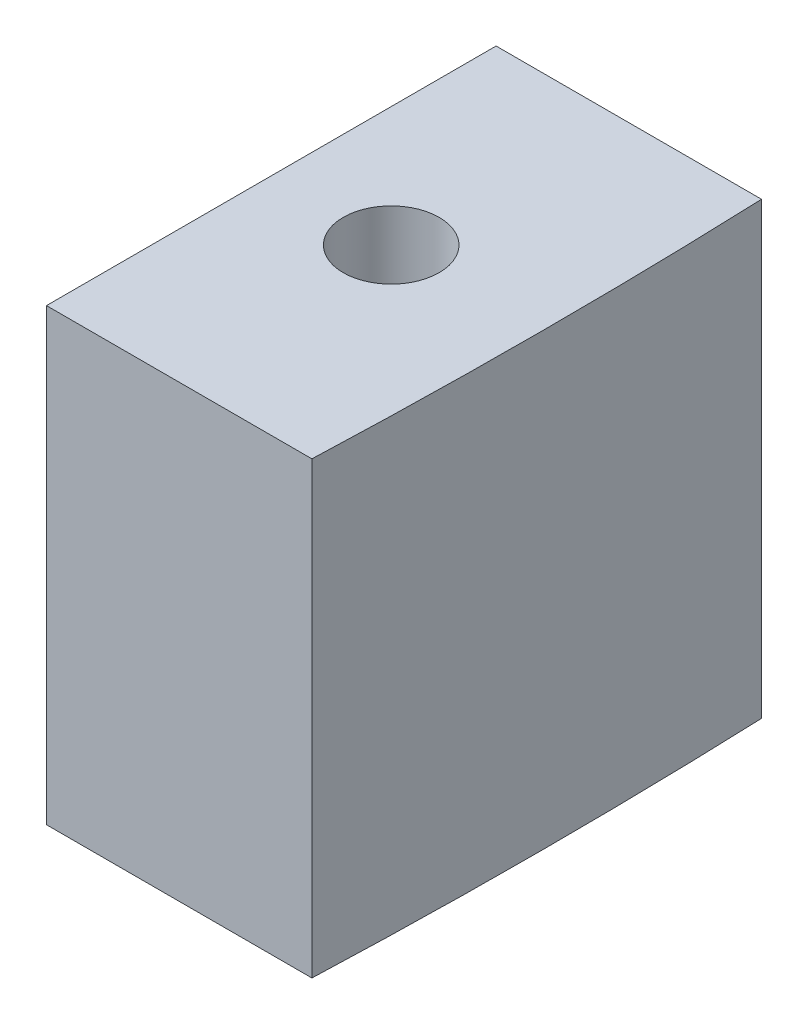
ISO-10303-21;
HEADER;
FILE_DESCRIPTION(('STEP AP214'),'2;1');
FILE_NAME('part.step','',(''),(''),'','','');
FILE_SCHEMA(('AUTOMOTIVE_DESIGN { 1 0 10303 214 1 1 1 1 }'));
ENDSEC;
DATA;
#1=APPLICATION_CONTEXT('core data for automotive mechanical design processes');
#2=APPLICATION_PROTOCOL_DEFINITION('international standard','automotive_design',2000,#1);
#3=PRODUCT_CONTEXT('',#1,'mechanical');
#4=PRODUCT('Part','Part','',(#3));
#5=PRODUCT_RELATED_PRODUCT_CATEGORY('part','',(#4));
#6=PRODUCT_DEFINITION_FORMATION('','',#4);
#7=PRODUCT_DEFINITION_CONTEXT('part definition',#1,'design');
#8=PRODUCT_DEFINITION('design','',#6,#7);
#9=PRODUCT_DEFINITION_SHAPE('','',#8);
#10=(LENGTH_UNIT() NAMED_UNIT(*) SI_UNIT(.MILLI.,.METRE.));
#11=(NAMED_UNIT(*) PLANE_ANGLE_UNIT() SI_UNIT($,.RADIAN.));
#12=(NAMED_UNIT(*) SI_UNIT($,.STERADIAN.) SOLID_ANGLE_UNIT());
#13=UNCERTAINTY_MEASURE_WITH_UNIT(LENGTH_MEASURE(1.E-05),#10,'distance_accuracy_value','');
#14=(GEOMETRIC_REPRESENTATION_CONTEXT(3) GLOBAL_UNCERTAINTY_ASSIGNED_CONTEXT((#13)) GLOBAL_UNIT_ASSIGNED_CONTEXT((#10,
#11,#12)) REPRESENTATION_CONTEXT('',''));
#15=CARTESIAN_POINT('',(0.,0.,0.));
#16=DIRECTION('',(0.,0.,1.));
#17=DIRECTION('',(1.,0.,0.));
#18=AXIS2_PLACEMENT_3D('',#15,#16,#17);
#19=CARTESIAN_POINT('',(-29.4485422847458,0.,0.));
#20=DIRECTION('',(0.,-1.,0.));
#21=DIRECTION('',(0.,0.,-1.));
#22=AXIS2_PLACEMENT_3D('',#19,#20,#21);
#23=CYLINDRICAL_SURFACE('',#22,1.59999999999999);
#24=CARTESIAN_POINT('',(-29.4485422847458,15.,0.));
#25=DIRECTION('',(0.,1.,0.));
#26=DIRECTION('',(0.,0.,1.));
#27=AXIS2_PLACEMENT_3D('',#24,#25,#26);
#28=CIRCLE('',#27,1.59999999999999);
#29=CARTESIAN_POINT('',(-29.4485422847458,15.,1.59999999999999));
#30=VERTEX_POINT('',#29);
#31=EDGE_CURVE('E167',#30,#30,#28,.T.);
#32=ORIENTED_EDGE('',*,*,#31,.T.);
#33=EDGE_LOOP('',(#32));
#34=FACE_BOUND('',#33,.T.);
#35=CARTESIAN_POINT('',(-29.4485422847458,4.,0.));
#36=DIRECTION('',(0.,-1.,0.));
#37=DIRECTION('',(0.,0.,-1.));
#38=AXIS2_PLACEMENT_3D('',#35,#36,#37);
#39=CIRCLE('',#38,1.59999999999999);
#40=CARTESIAN_POINT('',(-29.4485422847458,4.,-1.59999999999999));
#41=VERTEX_POINT('',#40);
#42=EDGE_CURVE('E38',#41,#41,#39,.F.);
#43=ORIENTED_EDGE('',*,*,#42,.F.);
#44=EDGE_LOOP('',(#43));
#45=FACE_BOUND('',#44,.T.);
#46=ADVANCED_FACE('F34',(#34,#45),#23,.F.);
#47=CARTESIAN_POINT('',(0.,0.,0.));
#48=DIRECTION('',(0.,1.,0.));
#49=DIRECTION('',(0.,0.,1.));
#50=AXIS2_PLACEMENT_3D('',#47,#48,#49);
#51=PLANE('',#50);
#52=DIRECTION('',(0.866025403784438,0.,0.5));
#53=VECTOR('',#52,1.);
#54=CARTESIAN_POINT('',(-29.4485422847458,0.,-3.34863156129983));
#55=LINE('',#54,#53);
#56=CARTESIAN_POINT('',(-29.4485422847458,0.,-3.34863156129983));
#57=VERTEX_POINT('',#56);
#58=CARTESIAN_POINT('',(-26.5485422847458,0.,-1.67431578064991));
#59=VERTEX_POINT('',#58);
#60=EDGE_CURVE('E148',#57,#59,#55,.T.);
#61=ORIENTED_EDGE('',*,*,#60,.F.);
#62=DIRECTION('',(0.866025403784439,0.,-0.5));
#63=VECTOR('',#62,1.);
#64=CARTESIAN_POINT('',(-32.3485422847457,0.,-1.67431578064992));
#65=LINE('',#64,#63);
#66=CARTESIAN_POINT('',(-32.3485422847457,0.,-1.67431578064992));
#67=VERTEX_POINT('',#66);
#68=EDGE_CURVE('E50',#67,#57,#65,.T.);
#69=ORIENTED_EDGE('',*,*,#68,.F.);
#70=DIRECTION('',(0.,0.,-1.));
#71=VECTOR('',#70,1.);
#72=CARTESIAN_POINT('',(-32.3485422847457,0.,1.67431578064991));
#73=LINE('',#72,#71);
#74=CARTESIAN_POINT('',(-32.3485422847457,0.,1.67431578064991));
#75=VERTEX_POINT('',#74);
#76=EDGE_CURVE('E134',#75,#67,#73,.T.);
#77=ORIENTED_EDGE('',*,*,#76,.F.);
#78=DIRECTION('',(-0.866025403784439,0.,-0.5));
#79=VECTOR('',#78,1.);
#80=CARTESIAN_POINT('',(-29.4485422847457,0.,3.34863156129982));
#81=LINE('',#80,#79);
#82=CARTESIAN_POINT('',(-29.4485422847457,0.,3.34863156129982));
#83=VERTEX_POINT('',#82);
#84=EDGE_CURVE('E137',#83,#75,#81,.T.);
#85=ORIENTED_EDGE('',*,*,#84,.F.);
#86=DIRECTION('',(-0.866025403784439,0.,0.5));
#87=VECTOR('',#86,1.);
#88=CARTESIAN_POINT('',(-26.5485422847458,0.,1.67431578064991));
#89=LINE('',#88,#87);
#90=CARTESIAN_POINT('',(-26.5485422847458,0.,1.67431578064991));
#91=VERTEX_POINT('',#90);
#92=EDGE_CURVE('E153',#91,#83,#89,.T.);
#93=ORIENTED_EDGE('',*,*,#92,.F.);
#94=DIRECTION('',(0.,0.,1.));
#95=VECTOR('',#94,1.);
#96=CARTESIAN_POINT('',(-26.5485422847458,0.,-1.67431578064991));
#97=LINE('',#96,#95);
#98=EDGE_CURVE('E150',#59,#91,#97,.T.);
#99=ORIENTED_EDGE('',*,*,#98,.F.);
#100=EDGE_LOOP('',(#61,#69,#77,#85,#93,#99));
#101=FACE_BOUND('',#100,.T.);
#102=DIRECTION('',(-1.,0.,0.));
#103=VECTOR('',#102,1.);
#104=CARTESIAN_POINT('',(-33.4485422847458,0.,-7.5));
#105=LINE('',#104,#103);
#106=CARTESIAN_POINT('',(-24.5935707209501,0.,-7.5));
#107=VERTEX_POINT('',#106);
#108=CARTESIAN_POINT('',(-33.4485422847458,0.,-7.5));
#109=VERTEX_POINT('',#108);
#110=EDGE_CURVE('E177',#107,#109,#105,.T.);
#111=ORIENTED_EDGE('',*,*,#110,.F.);
#112=CARTESIAN_POINT('',(-218.448542284746,0.,0.));
#113=DIRECTION('',(0.,1.,0.));
#114=DIRECTION('',(0.,0.,-1.));
#115=AXIS2_PLACEMENT_3D('',#112,#113,#114);
#116=CIRCLE('',#115,194.);
#117=CARTESIAN_POINT('',(-24.5935707209501,0.,7.5));
#118=VERTEX_POINT('',#117);
#119=EDGE_CURVE('E173',#118,#107,#116,.T.);
#120=ORIENTED_EDGE('',*,*,#119,.F.);
#121=DIRECTION('',(1.,0.,0.));
#122=VECTOR('',#121,1.);
#123=CARTESIAN_POINT('',(-33.4485422847458,0.,7.5));
#124=LINE('',#123,#122);
#125=CARTESIAN_POINT('',(-33.4485422847458,0.,7.5));
#126=VERTEX_POINT('',#125);
#127=EDGE_CURVE('E183',#126,#118,#124,.T.);
#128=ORIENTED_EDGE('',*,*,#127,.F.);
#129=DIRECTION('',(0.,0.,1.));
#130=VECTOR('',#129,1.);
#131=CARTESIAN_POINT('',(-33.4485422847458,0.,-7.5));
#132=LINE('',#131,#130);
#133=EDGE_CURVE('E189',#109,#126,#132,.T.);
#134=ORIENTED_EDGE('',*,*,#133,.F.);
#135=EDGE_LOOP('',(#111,#120,#128,#134));
#136=FACE_BOUND('',#135,.T.);
#137=ADVANCED_FACE('F204',(#101,#136),#51,.F.);
#138=CARTESIAN_POINT('',(-33.4485422847458,15.,-7.5));
#139=DIRECTION('',(0.,0.,1.));
#140=DIRECTION('',(1.,0.,0.));
#141=AXIS2_PLACEMENT_3D('',#138,#139,#140);
#142=PLANE('',#141);
#143=DIRECTION('',(-1.,0.,0.));
#144=VECTOR('',#143,1.);
#145=CARTESIAN_POINT('',(-33.4485422847458,15.,-7.5));
#146=LINE('',#145,#144);
#147=CARTESIAN_POINT('',(-24.5935707209501,15.,-7.5));
#148=VERTEX_POINT('',#147);
#149=CARTESIAN_POINT('',(-33.4485422847458,15.,-7.5));
#150=VERTEX_POINT('',#149);
#151=EDGE_CURVE('E180',#148,#150,#146,.T.);
#152=ORIENTED_EDGE('',*,*,#151,.F.);
#153=DIRECTION('',(0.,-1.,0.));
#154=VECTOR('',#153,1.);
#155=CARTESIAN_POINT('',(-24.5935707209501,15.001,-7.5));
#156=LINE('',#155,#154);
#157=EDGE_CURVE('E175',#148,#107,#156,.T.);
#158=ORIENTED_EDGE('',*,*,#157,.T.);
#159=ORIENTED_EDGE('',*,*,#110,.T.);
#160=DIRECTION('',(0.,-1.,0.));
#161=VECTOR('',#160,1.);
#162=CARTESIAN_POINT('',(-33.4485422847458,15.,-7.5));
#163=LINE('',#162,#161);
#164=EDGE_CURVE('E11',#150,#109,#163,.T.);
#165=ORIENTED_EDGE('',*,*,#164,.F.);
#166=EDGE_LOOP('',(#152,#158,#159,#165));
#167=FACE_BOUND('',#166,.T.);
#168=ADVANCED_FACE('F36',(#167),#142,.F.);
#169=CARTESIAN_POINT('',(-33.4485422847458,15.,-7.5));
#170=DIRECTION('',(1.,0.,0.));
#171=DIRECTION('',(0.,0.,-1.));
#172=AXIS2_PLACEMENT_3D('',#169,#170,#171);
#173=PLANE('',#172);
#174=ORIENTED_EDGE('',*,*,#133,.T.);
#175=DIRECTION('',(0.,-1.,0.));
#176=VECTOR('',#175,1.);
#177=CARTESIAN_POINT('',(-33.4485422847458,15.,7.5));
#178=LINE('',#177,#176);
#179=CARTESIAN_POINT('',(-33.4485422847458,15.,7.5));
#180=VERTEX_POINT('',#179);
#181=EDGE_CURVE('E43',#180,#126,#178,.T.);
#182=ORIENTED_EDGE('',*,*,#181,.F.);
#183=DIRECTION('',(0.,0.,1.));
#184=VECTOR('',#183,1.);
#185=CARTESIAN_POINT('',(-33.4485422847458,15.,-7.5));
#186=LINE('',#185,#184);
#187=EDGE_CURVE('E182',#150,#180,#186,.T.);
#188=ORIENTED_EDGE('',*,*,#187,.F.);
#189=ORIENTED_EDGE('',*,*,#164,.T.);
#190=EDGE_LOOP('',(#174,#182,#188,#189));
#191=FACE_BOUND('',#190,.T.);
#192=ADVANCED_FACE('F211',(#191),#173,.F.);
#193=CARTESIAN_POINT('',(-33.4485422847458,15.,7.5));
#194=DIRECTION('',(0.,0.,-1.));
#195=DIRECTION('',(-1.,0.,0.));
#196=AXIS2_PLACEMENT_3D('',#193,#194,#195);
#197=PLANE('',#196);
#198=ORIENTED_EDGE('',*,*,#127,.T.);
#199=DIRECTION('',(0.,-1.,0.));
#200=VECTOR('',#199,1.);
#201=CARTESIAN_POINT('',(-24.5935707209501,15.001,7.5));
#202=LINE('',#201,#200);
#203=CARTESIAN_POINT('',(-24.5935707209501,15.,7.5));
#204=VERTEX_POINT('',#203);
#205=EDGE_CURVE('E58',#204,#118,#202,.T.);
#206=ORIENTED_EDGE('',*,*,#205,.F.);
#207=DIRECTION('',(1.,0.,0.));
#208=VECTOR('',#207,1.);
#209=CARTESIAN_POINT('',(-33.4485422847458,15.,7.5));
#210=LINE('',#209,#208);
#211=EDGE_CURVE('E185',#180,#204,#210,.T.);
#212=ORIENTED_EDGE('',*,*,#211,.F.);
#213=ORIENTED_EDGE('',*,*,#181,.T.);
#214=EDGE_LOOP('',(#198,#206,#212,#213));
#215=FACE_BOUND('',#214,.T.);
#216=ADVANCED_FACE('F198',(#215),#197,.F.);
#217=CARTESIAN_POINT('',(0.,15.,0.));
#218=DIRECTION('',(0.,1.,0.));
#219=DIRECTION('',(0.,0.,1.));
#220=AXIS2_PLACEMENT_3D('',#217,#218,#219);
#221=PLANE('',#220);
#222=ORIENTED_EDGE('',*,*,#31,.F.);
#223=EDGE_LOOP('',(#222));
#224=FACE_BOUND('',#223,.T.);
#225=CARTESIAN_POINT('',(-218.448542284746,15.,0.));
#226=DIRECTION('',(0.,1.,0.));
#227=DIRECTION('',(0.,0.,1.));
#228=AXIS2_PLACEMENT_3D('',#225,#226,#227);
#229=CIRCLE('',#228,194.);
#230=EDGE_CURVE('E170',#204,#148,#229,.T.);
#231=ORIENTED_EDGE('',*,*,#230,.T.);
#232=ORIENTED_EDGE('',*,*,#151,.T.);
#233=ORIENTED_EDGE('',*,*,#187,.T.);
#234=ORIENTED_EDGE('',*,*,#211,.T.);
#235=EDGE_LOOP('',(#231,#232,#233,#234));
#236=FACE_BOUND('',#235,.T.);
#237=ADVANCED_FACE('F210',(#224,#236),#221,.T.);
#238=CARTESIAN_POINT('',(-218.448542284746,15.001,0.));
#239=DIRECTION('',(0.,-1.,0.));
#240=DIRECTION('',(0.,0.,-1.));
#241=AXIS2_PLACEMENT_3D('',#238,#239,#240);
#242=CYLINDRICAL_SURFACE('',#241,194.);
#243=ORIENTED_EDGE('',*,*,#205,.T.);
#244=ORIENTED_EDGE('',*,*,#119,.T.);
#245=ORIENTED_EDGE('',*,*,#157,.F.);
#246=ORIENTED_EDGE('',*,*,#230,.F.);
#247=EDGE_LOOP('',(#243,#244,#245,#246));
#248=FACE_BOUND('',#247,.T.);
#249=ADVANCED_FACE('F205',(#248),#242,.T.);
#250=CARTESIAN_POINT('',(0.,4.,0.));
#251=DIRECTION('',(0.,-1.,0.));
#252=DIRECTION('',(0.,0.,-1.));
#253=AXIS2_PLACEMENT_3D('',#250,#251,#252);
#254=PLANE('',#253);
#255=DIRECTION('',(0.866025403784439,0.,-0.5));
#256=VECTOR('',#255,1.);
#257=CARTESIAN_POINT('',(-32.3485422847457,4.,-1.67431578064992));
#258=LINE('',#257,#256);
#259=CARTESIAN_POINT('',(-32.3485422847457,4.,-1.67431578064992));
#260=VERTEX_POINT('',#259);
#261=CARTESIAN_POINT('',(-29.4485422847458,4.,-3.34863156129983));
#262=VERTEX_POINT('',#261);
#263=EDGE_CURVE('E114',#260,#262,#258,.T.);
#264=ORIENTED_EDGE('',*,*,#263,.T.);
#265=DIRECTION('',(0.866025403784438,0.,0.5));
#266=VECTOR('',#265,1.);
#267=CARTESIAN_POINT('',(-29.4485422847458,4.,-3.34863156129983));
#268=LINE('',#267,#266);
#269=CARTESIAN_POINT('',(-26.5485422847458,4.,-1.67431578064991));
#270=VERTEX_POINT('',#269);
#271=EDGE_CURVE('E123',#262,#270,#268,.T.);
#272=ORIENTED_EDGE('',*,*,#271,.T.);
#273=DIRECTION('',(0.,0.,1.));
#274=VECTOR('',#273,1.);
#275=CARTESIAN_POINT('',(-26.5485422847458,4.,-1.67431578064991));
#276=LINE('',#275,#274);
#277=CARTESIAN_POINT('',(-26.5485422847458,4.,1.67431578064991));
#278=VERTEX_POINT('',#277);
#279=EDGE_CURVE('E128',#270,#278,#276,.T.);
#280=ORIENTED_EDGE('',*,*,#279,.T.);
#281=DIRECTION('',(-0.866025403784439,0.,0.5));
#282=VECTOR('',#281,1.);
#283=CARTESIAN_POINT('',(-26.5485422847458,4.,1.67431578064991));
#284=LINE('',#283,#282);
#285=CARTESIAN_POINT('',(-29.4485422847457,4.,3.34863156129982));
#286=VERTEX_POINT('',#285);
#287=EDGE_CURVE('E141',#278,#286,#284,.T.);
#288=ORIENTED_EDGE('',*,*,#287,.T.);
#289=DIRECTION('',(-0.866025403784439,0.,-0.5));
#290=VECTOR('',#289,1.);
#291=CARTESIAN_POINT('',(-29.4485422847457,4.,3.34863156129982));
#292=LINE('',#291,#290);
#293=CARTESIAN_POINT('',(-32.3485422847457,4.,1.67431578064991));
#294=VERTEX_POINT('',#293);
#295=EDGE_CURVE('E144',#286,#294,#292,.T.);
#296=ORIENTED_EDGE('',*,*,#295,.T.);
#297=DIRECTION('',(0.,0.,-1.));
#298=VECTOR('',#297,1.);
#299=CARTESIAN_POINT('',(-32.3485422847457,4.,1.67431578064991));
#300=LINE('',#299,#298);
#301=EDGE_CURVE('E120',#294,#260,#300,.T.);
#302=ORIENTED_EDGE('',*,*,#301,.T.);
#303=EDGE_LOOP('',(#264,#272,#280,#288,#296,#302));
#304=FACE_BOUND('',#303,.T.);
#305=ORIENTED_EDGE('',*,*,#42,.T.);
#306=EDGE_LOOP('',(#305));
#307=FACE_BOUND('',#306,.T.);
#308=ADVANCED_FACE('F130',(#304,#307),#254,.T.);
#309=CARTESIAN_POINT('',(-32.3485422847457,4.,-1.67431578064992));
#310=DIRECTION('',(-0.5,0.,-0.866025403784439));
#311=DIRECTION('',(-0.866025403784439,0.,0.5));
#312=AXIS2_PLACEMENT_3D('',#309,#310,#311);
#313=PLANE('',#312);
#314=ORIENTED_EDGE('',*,*,#68,.T.);
#315=DIRECTION('',(0.,-1.,0.));
#316=VECTOR('',#315,1.);
#317=CARTESIAN_POINT('',(-29.4485422847458,4.,-3.34863156129983));
#318=LINE('',#317,#316);
#319=EDGE_CURVE('E110',#262,#57,#318,.T.);
#320=ORIENTED_EDGE('',*,*,#319,.F.);
#321=ORIENTED_EDGE('',*,*,#263,.F.);
#322=DIRECTION('',(0.,-1.,0.));
#323=VECTOR('',#322,1.);
#324=CARTESIAN_POINT('',(-32.3485422847457,4.,-1.67431578064992));
#325=LINE('',#324,#323);
#326=EDGE_CURVE('E158',#260,#67,#325,.T.);
#327=ORIENTED_EDGE('',*,*,#326,.T.);
#328=EDGE_LOOP('',(#314,#320,#321,#327));
#329=FACE_BOUND('',#328,.T.);
#330=ADVANCED_FACE('F112',(#329),#313,.F.);
#331=CARTESIAN_POINT('',(-32.3485422847457,4.,1.67431578064991));
#332=DIRECTION('',(-1.,0.,0.));
#333=DIRECTION('',(0.,0.,1.));
#334=AXIS2_PLACEMENT_3D('',#331,#332,#333);
#335=PLANE('',#334);
#336=ORIENTED_EDGE('',*,*,#76,.T.);
#337=ORIENTED_EDGE('',*,*,#326,.F.);
#338=ORIENTED_EDGE('',*,*,#301,.F.);
#339=DIRECTION('',(0.,-1.,0.));
#340=VECTOR('',#339,1.);
#341=CARTESIAN_POINT('',(-32.3485422847457,4.,1.67431578064991));
#342=LINE('',#341,#340);
#343=EDGE_CURVE('E160',#294,#75,#342,.T.);
#344=ORIENTED_EDGE('',*,*,#343,.T.);
#345=EDGE_LOOP('',(#336,#337,#338,#344));
#346=FACE_BOUND('',#345,.T.);
#347=ADVANCED_FACE('F266',(#346),#335,.F.);
#348=CARTESIAN_POINT('',(-29.4485422847457,4.,3.34863156129982));
#349=DIRECTION('',(-0.5,0.,0.866025403784439));
#350=DIRECTION('',(0.866025403784439,0.,0.5));
#351=AXIS2_PLACEMENT_3D('',#348,#349,#350);
#352=PLANE('',#351);
#353=ORIENTED_EDGE('',*,*,#84,.T.);
#354=ORIENTED_EDGE('',*,*,#343,.F.);
#355=ORIENTED_EDGE('',*,*,#295,.F.);
#356=DIRECTION('',(0.,-1.,0.));
#357=VECTOR('',#356,1.);
#358=CARTESIAN_POINT('',(-29.4485422847457,4.,3.34863156129982));
#359=LINE('',#358,#357);
#360=EDGE_CURVE('E162',#286,#83,#359,.T.);
#361=ORIENTED_EDGE('',*,*,#360,.T.);
#362=EDGE_LOOP('',(#353,#354,#355,#361));
#363=FACE_BOUND('',#362,.T.);
#364=ADVANCED_FACE('F274',(#363),#352,.F.);
#365=CARTESIAN_POINT('',(-26.5485422847458,4.,1.67431578064991));
#366=DIRECTION('',(0.5,0.,0.866025403784439));
#367=DIRECTION('',(0.866025403784439,0.,-0.5));
#368=AXIS2_PLACEMENT_3D('',#365,#366,#367);
#369=PLANE('',#368);
#370=ORIENTED_EDGE('',*,*,#92,.T.);
#371=ORIENTED_EDGE('',*,*,#360,.F.);
#372=ORIENTED_EDGE('',*,*,#287,.F.);
#373=DIRECTION('',(0.,-1.,0.));
#374=VECTOR('',#373,1.);
#375=CARTESIAN_POINT('',(-26.5485422847458,4.,1.67431578064991));
#376=LINE('',#375,#374);
#377=EDGE_CURVE('E164',#278,#91,#376,.T.);
#378=ORIENTED_EDGE('',*,*,#377,.T.);
#379=EDGE_LOOP('',(#370,#371,#372,#378));
#380=FACE_BOUND('',#379,.T.);
#381=ADVANCED_FACE('F284',(#380),#369,.F.);
#382=CARTESIAN_POINT('',(-26.5485422847458,4.,-1.67431578064991));
#383=DIRECTION('',(1.,0.,0.));
#384=DIRECTION('',(0.,0.,-1.));
#385=AXIS2_PLACEMENT_3D('',#382,#383,#384);
#386=PLANE('',#385);
#387=ORIENTED_EDGE('',*,*,#98,.T.);
#388=ORIENTED_EDGE('',*,*,#377,.F.);
#389=ORIENTED_EDGE('',*,*,#279,.F.);
#390=DIRECTION('',(0.,-1.,0.));
#391=VECTOR('',#390,1.);
#392=CARTESIAN_POINT('',(-26.5485422847458,4.,-1.67431578064991));
#393=LINE('',#392,#391);
#394=EDGE_CURVE('E119',#270,#59,#393,.T.);
#395=ORIENTED_EDGE('',*,*,#394,.T.);
#396=EDGE_LOOP('',(#387,#388,#389,#395));
#397=FACE_BOUND('',#396,.T.);
#398=ADVANCED_FACE('F294',(#397),#386,.F.);
#399=CARTESIAN_POINT('',(-29.4485422847458,4.,-3.34863156129983));
#400=DIRECTION('',(0.5,0.,-0.866025403784439));
#401=DIRECTION('',(-0.866025403784439,0.,-0.5));
#402=AXIS2_PLACEMENT_3D('',#399,#400,#401);
#403=PLANE('',#402);
#404=ORIENTED_EDGE('',*,*,#60,.T.);
#405=ORIENTED_EDGE('',*,*,#394,.F.);
#406=ORIENTED_EDGE('',*,*,#271,.F.);
#407=ORIENTED_EDGE('',*,*,#319,.T.);
#408=EDGE_LOOP('',(#404,#405,#406,#407));
#409=FACE_BOUND('',#408,.T.);
#410=ADVANCED_FACE('F124',(#409),#403,.F.);
#411=CLOSED_SHELL('',(#46,#137,#168,#192,#216,#237,#249,#308,#330,#347,#364,#381,#398,#410));
#412=MANIFOLD_SOLID_BREP('B2',#411);
#413=ADVANCED_BREP_SHAPE_REPRESENTATION('',(#18,#412),#14);
#414=SHAPE_DEFINITION_REPRESENTATION(#9,#413);
ENDSEC;
END-ISO-10303-21;
